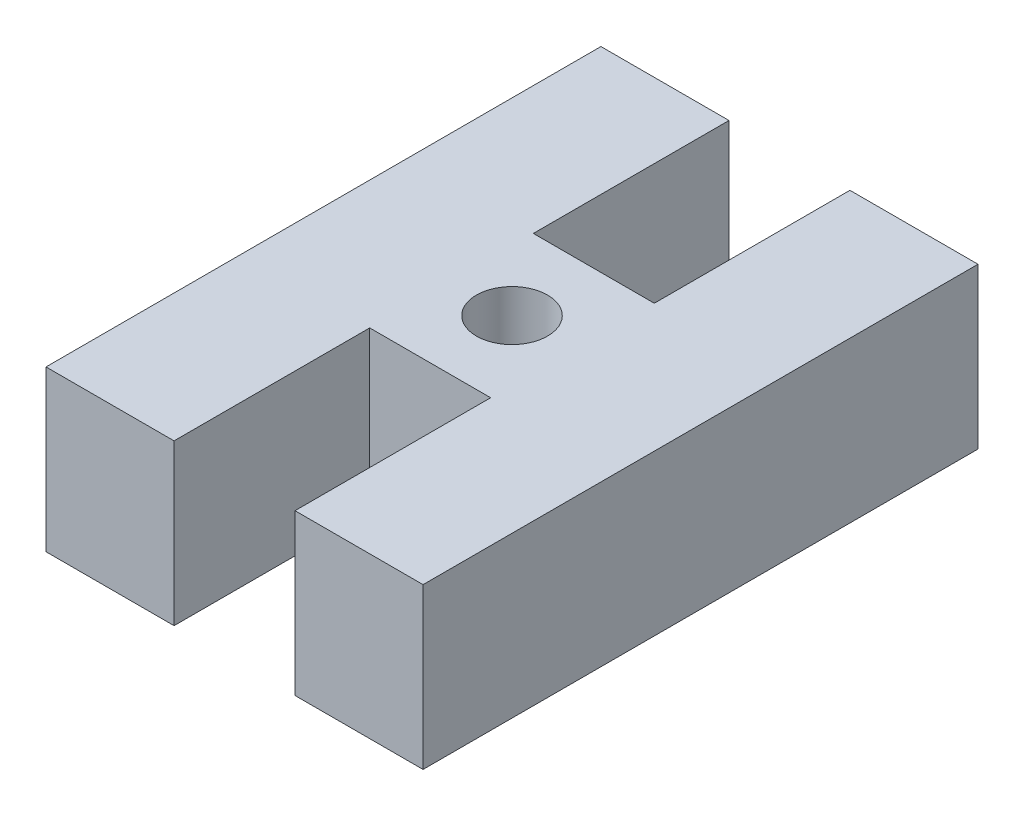
ISO-10303-21;
HEADER;
FILE_DESCRIPTION(('STEP AP214'),'2;1');
FILE_NAME('part.step','',(''),(''),'','','');
FILE_SCHEMA(('AUTOMOTIVE_DESIGN { 1 0 10303 214 1 1 1 1 }'));
ENDSEC;
DATA;
#1=APPLICATION_CONTEXT('core data for automotive mechanical design processes');
#2=APPLICATION_PROTOCOL_DEFINITION('international standard','automotive_design',2000,#1);
#3=PRODUCT_CONTEXT('',#1,'mechanical');
#4=PRODUCT('Part','Part','',(#3));
#5=PRODUCT_RELATED_PRODUCT_CATEGORY('part','',(#4));
#6=PRODUCT_DEFINITION_FORMATION('','',#4);
#7=PRODUCT_DEFINITION_CONTEXT('part definition',#1,'design');
#8=PRODUCT_DEFINITION('design','',#6,#7);
#9=PRODUCT_DEFINITION_SHAPE('','',#8);
#10=(LENGTH_UNIT() NAMED_UNIT(*) SI_UNIT(.MILLI.,.METRE.));
#11=(NAMED_UNIT(*) PLANE_ANGLE_UNIT() SI_UNIT($,.RADIAN.));
#12=(NAMED_UNIT(*) SI_UNIT($,.STERADIAN.) SOLID_ANGLE_UNIT());
#13=UNCERTAINTY_MEASURE_WITH_UNIT(LENGTH_MEASURE(1.E-05),#10,'distance_accuracy_value','');
#14=(GEOMETRIC_REPRESENTATION_CONTEXT(3) GLOBAL_UNCERTAINTY_ASSIGNED_CONTEXT((#13)) GLOBAL_UNIT_ASSIGNED_CONTEXT((#10,
#11,#12)) REPRESENTATION_CONTEXT('',''));
#15=CARTESIAN_POINT('',(0.,0.,0.));
#16=DIRECTION('',(0.,0.,1.));
#17=DIRECTION('',(1.,0.,0.));
#18=AXIS2_PLACEMENT_3D('',#15,#16,#17);
#19=CARTESIAN_POINT('',(-5.3,4.5,7.8));
#20=DIRECTION('',(0.,0.,-1.));
#21=DIRECTION('',(-1.,0.,0.));
#22=AXIS2_PLACEMENT_3D('',#19,#20,#21);
#23=PLANE('',#22);
#24=DIRECTION('',(1.,0.,0.));
#25=VECTOR('',#24,1.);
#26=CARTESIAN_POINT('',(-5.3,0.,7.8));
#27=LINE('',#26,#25);
#28=CARTESIAN_POINT('',(-5.3,0.,7.8));
#29=VERTEX_POINT('',#28);
#30=CARTESIAN_POINT('',(-1.7,0.,7.8));
#31=VERTEX_POINT('',#30);
#32=EDGE_CURVE('E159',#29,#31,#27,.T.);
#33=ORIENTED_EDGE('',*,*,#32,.T.);
#34=DIRECTION('',(0.,-1.,0.));
#35=VECTOR('',#34,1.);
#36=CARTESIAN_POINT('',(-1.7,4.5,7.8));
#37=LINE('',#36,#35);
#38=CARTESIAN_POINT('',(-1.7,4.5,7.8));
#39=VERTEX_POINT('',#38);
#40=EDGE_CURVE('E11',#39,#31,#37,.T.);
#41=ORIENTED_EDGE('',*,*,#40,.F.);
#42=DIRECTION('',(1.,0.,0.));
#43=VECTOR('',#42,1.);
#44=CARTESIAN_POINT('',(-5.3,4.5,7.8));
#45=LINE('',#44,#43);
#46=CARTESIAN_POINT('',(-5.3,4.5,7.8));
#47=VERTEX_POINT('',#46);
#48=EDGE_CURVE('E187',#47,#39,#45,.T.);
#49=ORIENTED_EDGE('',*,*,#48,.F.);
#50=DIRECTION('',(0.,-1.,0.));
#51=VECTOR('',#50,1.);
#52=CARTESIAN_POINT('',(-5.3,4.5,7.8));
#53=LINE('',#52,#51);
#54=EDGE_CURVE('E54',#47,#29,#53,.T.);
#55=ORIENTED_EDGE('',*,*,#54,.T.);
#56=EDGE_LOOP('',(#33,#41,#49,#55));
#57=FACE_BOUND('',#56,.T.);
#58=ADVANCED_FACE('F39',(#57),#23,.F.);
#59=CARTESIAN_POINT('',(-1.7,4.5,7.8));
#60=DIRECTION('',(-1.,0.,0.));
#61=DIRECTION('',(0.,0.,1.));
#62=AXIS2_PLACEMENT_3D('',#59,#60,#61);
#63=PLANE('',#62);
#64=DIRECTION('',(0.,0.,-1.));
#65=VECTOR('',#64,1.);
#66=CARTESIAN_POINT('',(-1.7,0.,7.8));
#67=LINE('',#66,#65);
#68=CARTESIAN_POINT('',(-1.7,0.,2.3));
#69=VERTEX_POINT('',#68);
#70=EDGE_CURVE('E165',#31,#69,#67,.T.);
#71=ORIENTED_EDGE('',*,*,#70,.T.);
#72=DIRECTION('',(0.,-1.,0.));
#73=VECTOR('',#72,1.);
#74=CARTESIAN_POINT('',(-1.7,4.5,2.3));
#75=LINE('',#74,#73);
#76=CARTESIAN_POINT('',(-1.7,4.5,2.3));
#77=VERTEX_POINT('',#76);
#78=EDGE_CURVE('E50',#77,#69,#75,.T.);
#79=ORIENTED_EDGE('',*,*,#78,.F.);
#80=DIRECTION('',(0.,0.,-1.));
#81=VECTOR('',#80,1.);
#82=CARTESIAN_POINT('',(-1.7,4.5,7.8));
#83=LINE('',#82,#81);
#84=EDGE_CURVE('E104',#39,#77,#83,.T.);
#85=ORIENTED_EDGE('',*,*,#84,.F.);
#86=ORIENTED_EDGE('',*,*,#40,.T.);
#87=EDGE_LOOP('',(#71,#79,#85,#86));
#88=FACE_BOUND('',#87,.T.);
#89=ADVANCED_FACE('F260',(#88),#63,.F.);
#90=CARTESIAN_POINT('',(-1.7,4.5,2.3));
#91=DIRECTION('',(0.,0.,-1.));
#92=DIRECTION('',(-1.,0.,0.));
#93=AXIS2_PLACEMENT_3D('',#90,#91,#92);
#94=PLANE('',#93);
#95=DIRECTION('',(1.,0.,0.));
#96=VECTOR('',#95,1.);
#97=CARTESIAN_POINT('',(-1.7,0.,2.3));
#98=LINE('',#97,#96);
#99=CARTESIAN_POINT('',(1.7,0.,2.3));
#100=VERTEX_POINT('',#99);
#101=EDGE_CURVE('E164',#69,#100,#98,.T.);
#102=ORIENTED_EDGE('',*,*,#101,.T.);
#103=DIRECTION('',(0.,-1.,0.));
#104=VECTOR('',#103,1.);
#105=CARTESIAN_POINT('',(1.7,4.5,2.3));
#106=LINE('',#105,#104);
#107=CARTESIAN_POINT('',(1.7,4.5,2.3));
#108=VERTEX_POINT('',#107);
#109=EDGE_CURVE('E202',#108,#100,#106,.T.);
#110=ORIENTED_EDGE('',*,*,#109,.F.);
#111=DIRECTION('',(1.,0.,0.));
#112=VECTOR('',#111,1.);
#113=CARTESIAN_POINT('',(-1.7,4.5,2.3));
#114=LINE('',#113,#112);
#115=EDGE_CURVE('E213',#77,#108,#114,.T.);
#116=ORIENTED_EDGE('',*,*,#115,.F.);
#117=ORIENTED_EDGE('',*,*,#78,.T.);
#118=EDGE_LOOP('',(#102,#110,#116,#117));
#119=FACE_BOUND('',#118,.T.);
#120=ADVANCED_FACE('F211',(#119),#94,.F.);
#121=CARTESIAN_POINT('',(1.7,4.5,2.3));
#122=DIRECTION('',(1.,0.,0.));
#123=DIRECTION('',(0.,0.,-1.));
#124=AXIS2_PLACEMENT_3D('',#121,#122,#123);
#125=PLANE('',#124);
#126=DIRECTION('',(0.,0.,1.));
#127=VECTOR('',#126,1.);
#128=CARTESIAN_POINT('',(1.7,0.,2.3));
#129=LINE('',#128,#127);
#130=CARTESIAN_POINT('',(1.7,0.,7.8));
#131=VERTEX_POINT('',#130);
#132=EDGE_CURVE('E170',#100,#131,#129,.T.);
#133=ORIENTED_EDGE('',*,*,#132,.T.);
#134=DIRECTION('',(0.,-1.,0.));
#135=VECTOR('',#134,1.);
#136=CARTESIAN_POINT('',(1.7,4.5,7.8));
#137=LINE('',#136,#135);
#138=CARTESIAN_POINT('',(1.7,4.5,7.8));
#139=VERTEX_POINT('',#138);
#140=EDGE_CURVE('E205',#139,#131,#137,.T.);
#141=ORIENTED_EDGE('',*,*,#140,.F.);
#142=DIRECTION('',(0.,0.,1.));
#143=VECTOR('',#142,1.);
#144=CARTESIAN_POINT('',(1.7,4.5,2.3));
#145=LINE('',#144,#143);
#146=EDGE_CURVE('E227',#108,#139,#145,.T.);
#147=ORIENTED_EDGE('',*,*,#146,.F.);
#148=ORIENTED_EDGE('',*,*,#109,.T.);
#149=EDGE_LOOP('',(#133,#141,#147,#148));
#150=FACE_BOUND('',#149,.T.);
#151=ADVANCED_FACE('F219',(#150),#125,.F.);
#152=CARTESIAN_POINT('',(1.7,4.5,7.8));
#153=DIRECTION('',(0.,0.,-1.));
#154=DIRECTION('',(-1.,0.,0.));
#155=AXIS2_PLACEMENT_3D('',#152,#153,#154);
#156=PLANE('',#155);
#157=DIRECTION('',(1.,0.,0.));
#158=VECTOR('',#157,1.);
#159=CARTESIAN_POINT('',(1.7,0.,7.8));
#160=LINE('',#159,#158);
#161=CARTESIAN_POINT('',(5.3,0.,7.8));
#162=VERTEX_POINT('',#161);
#163=EDGE_CURVE('E166',#131,#162,#160,.T.);
#164=ORIENTED_EDGE('',*,*,#163,.T.);
#165=DIRECTION('',(0.,-1.,0.));
#166=VECTOR('',#165,1.);
#167=CARTESIAN_POINT('',(5.3,4.5,7.8));
#168=LINE('',#167,#166);
#169=CARTESIAN_POINT('',(5.3,4.5,7.8));
#170=VERTEX_POINT('',#169);
#171=EDGE_CURVE('E199',#170,#162,#168,.T.);
#172=ORIENTED_EDGE('',*,*,#171,.F.);
#173=DIRECTION('',(1.,0.,0.));
#174=VECTOR('',#173,1.);
#175=CARTESIAN_POINT('',(1.7,4.5,7.8));
#176=LINE('',#175,#174);
#177=EDGE_CURVE('E229',#139,#170,#176,.T.);
#178=ORIENTED_EDGE('',*,*,#177,.F.);
#179=ORIENTED_EDGE('',*,*,#140,.T.);
#180=EDGE_LOOP('',(#164,#172,#178,#179));
#181=FACE_BOUND('',#180,.T.);
#182=ADVANCED_FACE('F221',(#181),#156,.F.);
#183=CARTESIAN_POINT('',(5.3,4.5,-7.8));
#184=DIRECTION('',(1.,0.,0.));
#185=DIRECTION('',(0.,0.,-1.));
#186=AXIS2_PLACEMENT_3D('',#183,#184,#185);
#187=PLANE('',#186);
#188=DIRECTION('',(0.,0.,1.));
#189=VECTOR('',#188,1.);
#190=CARTESIAN_POINT('',(5.3,0.,-7.8));
#191=LINE('',#190,#189);
#192=CARTESIAN_POINT('',(5.3,0.,-7.8));
#193=VERTEX_POINT('',#192);
#194=EDGE_CURVE('E171',#193,#162,#191,.T.);
#195=ORIENTED_EDGE('',*,*,#194,.F.);
#196=DIRECTION('',(0.,-1.,0.));
#197=VECTOR('',#196,1.);
#198=CARTESIAN_POINT('',(5.3,4.5,-7.8));
#199=LINE('',#198,#197);
#200=CARTESIAN_POINT('',(5.3,4.5,-7.8));
#201=VERTEX_POINT('',#200);
#202=EDGE_CURVE('E196',#201,#193,#199,.T.);
#203=ORIENTED_EDGE('',*,*,#202,.F.);
#204=DIRECTION('',(0.,0.,1.));
#205=VECTOR('',#204,1.);
#206=CARTESIAN_POINT('',(5.3,4.5,-7.8));
#207=LINE('',#206,#205);
#208=EDGE_CURVE('E228',#201,#170,#207,.T.);
#209=ORIENTED_EDGE('',*,*,#208,.T.);
#210=ORIENTED_EDGE('',*,*,#171,.T.);
#211=EDGE_LOOP('',(#195,#203,#209,#210));
#212=FACE_BOUND('',#211,.T.);
#213=ADVANCED_FACE('F331',(#212),#187,.T.);
#214=CARTESIAN_POINT('',(1.7,4.5,-7.8));
#215=DIRECTION('',(0.,0.,-1.));
#216=DIRECTION('',(-1.,0.,0.));
#217=AXIS2_PLACEMENT_3D('',#214,#215,#216);
#218=PLANE('',#217);
#219=DIRECTION('',(1.,0.,0.));
#220=VECTOR('',#219,1.);
#221=CARTESIAN_POINT('',(1.7,0.,-7.8));
#222=LINE('',#221,#220);
#223=CARTESIAN_POINT('',(1.7,0.,-7.8));
#224=VERTEX_POINT('',#223);
#225=EDGE_CURVE('E172',#224,#193,#222,.T.);
#226=ORIENTED_EDGE('',*,*,#225,.F.);
#227=DIRECTION('',(0.,-1.,0.));
#228=VECTOR('',#227,1.);
#229=CARTESIAN_POINT('',(1.7,4.5,-7.8));
#230=LINE('',#229,#228);
#231=CARTESIAN_POINT('',(1.7,4.5,-7.8));
#232=VERTEX_POINT('',#231);
#233=EDGE_CURVE('E198',#232,#224,#230,.T.);
#234=ORIENTED_EDGE('',*,*,#233,.F.);
#235=DIRECTION('',(1.,0.,0.));
#236=VECTOR('',#235,1.);
#237=CARTESIAN_POINT('',(1.7,4.5,-7.8));
#238=LINE('',#237,#236);
#239=EDGE_CURVE('E235',#232,#201,#238,.T.);
#240=ORIENTED_EDGE('',*,*,#239,.T.);
#241=ORIENTED_EDGE('',*,*,#202,.T.);
#242=EDGE_LOOP('',(#226,#234,#240,#241));
#243=FACE_BOUND('',#242,.T.);
#244=ADVANCED_FACE('F322',(#243),#218,.T.);
#245=CARTESIAN_POINT('',(1.7,4.5,-2.3));
#246=DIRECTION('',(-1.,0.,0.));
#247=DIRECTION('',(0.,0.,1.));
#248=AXIS2_PLACEMENT_3D('',#245,#246,#247);
#249=PLANE('',#248);
#250=DIRECTION('',(0.,0.,-1.));
#251=VECTOR('',#250,1.);
#252=CARTESIAN_POINT('',(1.7,0.,-2.3));
#253=LINE('',#252,#251);
#254=CARTESIAN_POINT('',(1.7,0.,-2.3));
#255=VERTEX_POINT('',#254);
#256=EDGE_CURVE('E179',#255,#224,#253,.T.);
#257=ORIENTED_EDGE('',*,*,#256,.F.);
#258=DIRECTION('',(0.,-1.,0.));
#259=VECTOR('',#258,1.);
#260=CARTESIAN_POINT('',(1.7,4.5,-2.3));
#261=LINE('',#260,#259);
#262=CARTESIAN_POINT('',(1.7,4.5,-2.3));
#263=VERTEX_POINT('',#262);
#264=EDGE_CURVE('E191',#263,#255,#261,.T.);
#265=ORIENTED_EDGE('',*,*,#264,.F.);
#266=DIRECTION('',(0.,0.,-1.));
#267=VECTOR('',#266,1.);
#268=CARTESIAN_POINT('',(1.7,4.5,-2.3));
#269=LINE('',#268,#267);
#270=EDGE_CURVE('E239',#263,#232,#269,.T.);
#271=ORIENTED_EDGE('',*,*,#270,.T.);
#272=ORIENTED_EDGE('',*,*,#233,.T.);
#273=EDGE_LOOP('',(#257,#265,#271,#272));
#274=FACE_BOUND('',#273,.T.);
#275=ADVANCED_FACE('F312',(#274),#249,.T.);
#276=CARTESIAN_POINT('',(-1.7,4.5,-2.3));
#277=DIRECTION('',(0.,0.,-1.));
#278=DIRECTION('',(-1.,0.,0.));
#279=AXIS2_PLACEMENT_3D('',#276,#277,#278);
#280=PLANE('',#279);
#281=DIRECTION('',(1.,0.,0.));
#282=VECTOR('',#281,1.);
#283=CARTESIAN_POINT('',(-1.7,0.,-2.3));
#284=LINE('',#283,#282);
#285=CARTESIAN_POINT('',(-1.7,0.,-2.3));
#286=VERTEX_POINT('',#285);
#287=EDGE_CURVE('E182',#286,#255,#284,.T.);
#288=ORIENTED_EDGE('',*,*,#287,.F.);
#289=DIRECTION('',(0.,-1.,0.));
#290=VECTOR('',#289,1.);
#291=CARTESIAN_POINT('',(-1.7,4.5,-2.3));
#292=LINE('',#291,#290);
#293=CARTESIAN_POINT('',(-1.7,4.5,-2.3));
#294=VERTEX_POINT('',#293);
#295=EDGE_CURVE('E142',#294,#286,#292,.T.);
#296=ORIENTED_EDGE('',*,*,#295,.F.);
#297=DIRECTION('',(1.,0.,0.));
#298=VECTOR('',#297,1.);
#299=CARTESIAN_POINT('',(-1.7,4.5,-2.3));
#300=LINE('',#299,#298);
#301=EDGE_CURVE('E155',#294,#263,#300,.T.);
#302=ORIENTED_EDGE('',*,*,#301,.T.);
#303=ORIENTED_EDGE('',*,*,#264,.T.);
#304=EDGE_LOOP('',(#288,#296,#302,#303));
#305=FACE_BOUND('',#304,.T.);
#306=ADVANCED_FACE('F245',(#305),#280,.T.);
#307=CARTESIAN_POINT('',(-1.7,4.5,-7.8));
#308=DIRECTION('',(1.,0.,0.));
#309=DIRECTION('',(0.,0.,-1.));
#310=AXIS2_PLACEMENT_3D('',#307,#308,#309);
#311=PLANE('',#310);
#312=DIRECTION('',(0.,0.,1.));
#313=VECTOR('',#312,1.);
#314=CARTESIAN_POINT('',(-1.7,0.,-7.8));
#315=LINE('',#314,#313);
#316=CARTESIAN_POINT('',(-1.7,0.,-7.8));
#317=VERTEX_POINT('',#316);
#318=EDGE_CURVE('E139',#317,#286,#315,.T.);
#319=ORIENTED_EDGE('',*,*,#318,.F.);
#320=DIRECTION('',(0.,-1.,0.));
#321=VECTOR('',#320,1.);
#322=CARTESIAN_POINT('',(-1.7,4.5,-7.8));
#323=LINE('',#322,#321);
#324=CARTESIAN_POINT('',(-1.7,4.5,-7.8));
#325=VERTEX_POINT('',#324);
#326=EDGE_CURVE('E135',#325,#317,#323,.T.);
#327=ORIENTED_EDGE('',*,*,#326,.F.);
#328=DIRECTION('',(0.,0.,1.));
#329=VECTOR('',#328,1.);
#330=CARTESIAN_POINT('',(-1.7,4.5,-7.8));
#331=LINE('',#330,#329);
#332=EDGE_CURVE('E137',#325,#294,#331,.T.);
#333=ORIENTED_EDGE('',*,*,#332,.T.);
#334=ORIENTED_EDGE('',*,*,#295,.T.);
#335=EDGE_LOOP('',(#319,#327,#333,#334));
#336=FACE_BOUND('',#335,.T.);
#337=ADVANCED_FACE('F132',(#336),#311,.T.);
#338=CARTESIAN_POINT('',(-5.3,4.5,-7.8));
#339=DIRECTION('',(0.,0.,-1.));
#340=DIRECTION('',(-1.,0.,0.));
#341=AXIS2_PLACEMENT_3D('',#338,#339,#340);
#342=PLANE('',#341);
#343=DIRECTION('',(1.,0.,0.));
#344=VECTOR('',#343,1.);
#345=CARTESIAN_POINT('',(-5.3,0.,-7.8));
#346=LINE('',#345,#344);
#347=CARTESIAN_POINT('',(-5.3,0.,-7.8));
#348=VERTEX_POINT('',#347);
#349=EDGE_CURVE('E183',#348,#317,#346,.T.);
#350=ORIENTED_EDGE('',*,*,#349,.F.);
#351=DIRECTION('',(0.,-1.,0.));
#352=VECTOR('',#351,1.);
#353=CARTESIAN_POINT('',(-5.3,4.5,-7.8));
#354=LINE('',#353,#352);
#355=CARTESIAN_POINT('',(-5.3,4.5,-7.8));
#356=VERTEX_POINT('',#355);
#357=EDGE_CURVE('E91',#356,#348,#354,.T.);
#358=ORIENTED_EDGE('',*,*,#357,.F.);
#359=DIRECTION('',(1.,0.,0.));
#360=VECTOR('',#359,1.);
#361=CARTESIAN_POINT('',(-5.3,4.5,-7.8));
#362=LINE('',#361,#360);
#363=EDGE_CURVE('E149',#356,#325,#362,.T.);
#364=ORIENTED_EDGE('',*,*,#363,.T.);
#365=ORIENTED_EDGE('',*,*,#326,.T.);
#366=EDGE_LOOP('',(#350,#358,#364,#365));
#367=FACE_BOUND('',#366,.T.);
#368=ADVANCED_FACE('F152',(#367),#342,.T.);
#369=CARTESIAN_POINT('',(-5.3,4.5,7.8));
#370=DIRECTION('',(-1.,0.,0.));
#371=DIRECTION('',(0.,0.,1.));
#372=AXIS2_PLACEMENT_3D('',#369,#370,#371);
#373=PLANE('',#372);
#374=DIRECTION('',(0.,0.,-1.));
#375=VECTOR('',#374,1.);
#376=CARTESIAN_POINT('',(-5.3,0.,7.8));
#377=LINE('',#376,#375);
#378=EDGE_CURVE('E186',#29,#348,#377,.T.);
#379=ORIENTED_EDGE('',*,*,#378,.F.);
#380=ORIENTED_EDGE('',*,*,#54,.F.);
#381=DIRECTION('',(0.,0.,-1.));
#382=VECTOR('',#381,1.);
#383=CARTESIAN_POINT('',(-5.3,4.5,7.8));
#384=LINE('',#383,#382);
#385=EDGE_CURVE('E154',#47,#356,#384,.T.);
#386=ORIENTED_EDGE('',*,*,#385,.T.);
#387=ORIENTED_EDGE('',*,*,#357,.T.);
#388=EDGE_LOOP('',(#379,#380,#386,#387));
#389=FACE_BOUND('',#388,.T.);
#390=ADVANCED_FACE('F242',(#389),#373,.T.);
#391=CARTESIAN_POINT('',(0.,4.5,0.));
#392=DIRECTION('',(0.,1.,0.));
#393=DIRECTION('',(0.,0.,1.));
#394=AXIS2_PLACEMENT_3D('',#391,#392,#393);
#395=PLANE('',#394);
#396=CARTESIAN_POINT('',(0.,4.5,0.));
#397=DIRECTION('',(0.,1.,0.));
#398=DIRECTION('',(0.,0.,1.));
#399=AXIS2_PLACEMENT_3D('',#396,#397,#398);
#400=CIRCLE('',#399,1.);
#401=CARTESIAN_POINT('',(0.,4.5,1.));
#402=VERTEX_POINT('',#401);
#403=EDGE_CURVE('E264',#402,#402,#400,.T.);
#404=ORIENTED_EDGE('',*,*,#403,.F.);
#405=EDGE_LOOP('',(#404));
#406=FACE_BOUND('',#405,.T.);
#407=ORIENTED_EDGE('',*,*,#48,.T.);
#408=ORIENTED_EDGE('',*,*,#84,.T.);
#409=ORIENTED_EDGE('',*,*,#115,.T.);
#410=ORIENTED_EDGE('',*,*,#146,.T.);
#411=ORIENTED_EDGE('',*,*,#177,.T.);
#412=ORIENTED_EDGE('',*,*,#208,.F.);
#413=ORIENTED_EDGE('',*,*,#239,.F.);
#414=ORIENTED_EDGE('',*,*,#270,.F.);
#415=ORIENTED_EDGE('',*,*,#301,.F.);
#416=ORIENTED_EDGE('',*,*,#332,.F.);
#417=ORIENTED_EDGE('',*,*,#363,.F.);
#418=ORIENTED_EDGE('',*,*,#385,.F.);
#419=EDGE_LOOP('',(#407,#408,#409,#410,#411,#412,#413,#414,#415,#416,#417,#418));
#420=FACE_BOUND('',#419,.T.);
#421=ADVANCED_FACE('F150',(#406,#420),#395,.T.);
#422=CARTESIAN_POINT('',(0.,0.,0.));
#423=DIRECTION('',(0.,1.,0.));
#424=DIRECTION('',(0.,0.,1.));
#425=AXIS2_PLACEMENT_3D('',#422,#423,#424);
#426=PLANE('',#425);
#427=CARTESIAN_POINT('',(0.,0.,0.));
#428=DIRECTION('',(0.,1.,0.));
#429=DIRECTION('',(0.,0.,1.));
#430=AXIS2_PLACEMENT_3D('',#427,#428,#429);
#431=CIRCLE('',#430,1.);
#432=CARTESIAN_POINT('',(0.,0.,1.));
#433=VERTEX_POINT('',#432);
#434=EDGE_CURVE('E162',#433,#433,#431,.T.);
#435=ORIENTED_EDGE('',*,*,#434,.T.);
#436=EDGE_LOOP('',(#435));
#437=FACE_BOUND('',#436,.T.);
#438=ORIENTED_EDGE('',*,*,#32,.F.);
#439=ORIENTED_EDGE('',*,*,#378,.T.);
#440=ORIENTED_EDGE('',*,*,#349,.T.);
#441=ORIENTED_EDGE('',*,*,#318,.T.);
#442=ORIENTED_EDGE('',*,*,#287,.T.);
#443=ORIENTED_EDGE('',*,*,#256,.T.);
#444=ORIENTED_EDGE('',*,*,#225,.T.);
#445=ORIENTED_EDGE('',*,*,#194,.T.);
#446=ORIENTED_EDGE('',*,*,#163,.F.);
#447=ORIENTED_EDGE('',*,*,#132,.F.);
#448=ORIENTED_EDGE('',*,*,#101,.F.);
#449=ORIENTED_EDGE('',*,*,#70,.F.);
#450=EDGE_LOOP('',(#438,#439,#440,#441,#442,#443,#444,#445,#446,#447,#448,#449));
#451=FACE_BOUND('',#450,.T.);
#452=ADVANCED_FACE('F216',(#437,#451),#426,.F.);
#453=CARTESIAN_POINT('',(0.,0.,0.));
#454=DIRECTION('',(0.,1.,0.));
#455=DIRECTION('',(0.,0.,1.));
#456=AXIS2_PLACEMENT_3D('',#453,#454,#455);
#457=CYLINDRICAL_SURFACE('',#456,1.);
#458=ORIENTED_EDGE('',*,*,#434,.F.);
#459=EDGE_LOOP('',(#458));
#460=FACE_BOUND('',#459,.T.);
#461=ORIENTED_EDGE('',*,*,#403,.T.);
#462=EDGE_LOOP('',(#461));
#463=FACE_BOUND('',#462,.T.);
#464=ADVANCED_FACE('F275',(#460,#463),#457,.F.);
#465=CLOSED_SHELL('',(#58,#89,#120,#151,#182,#213,#244,#275,#306,#337,#368,#390,#421,#452,#464));
#466=MANIFOLD_SOLID_BREP('B2',#465);
#467=ADVANCED_BREP_SHAPE_REPRESENTATION('',(#18,#466),#14);
#468=SHAPE_DEFINITION_REPRESENTATION(#9,#467);
ENDSEC;
END-ISO-10303-21;
